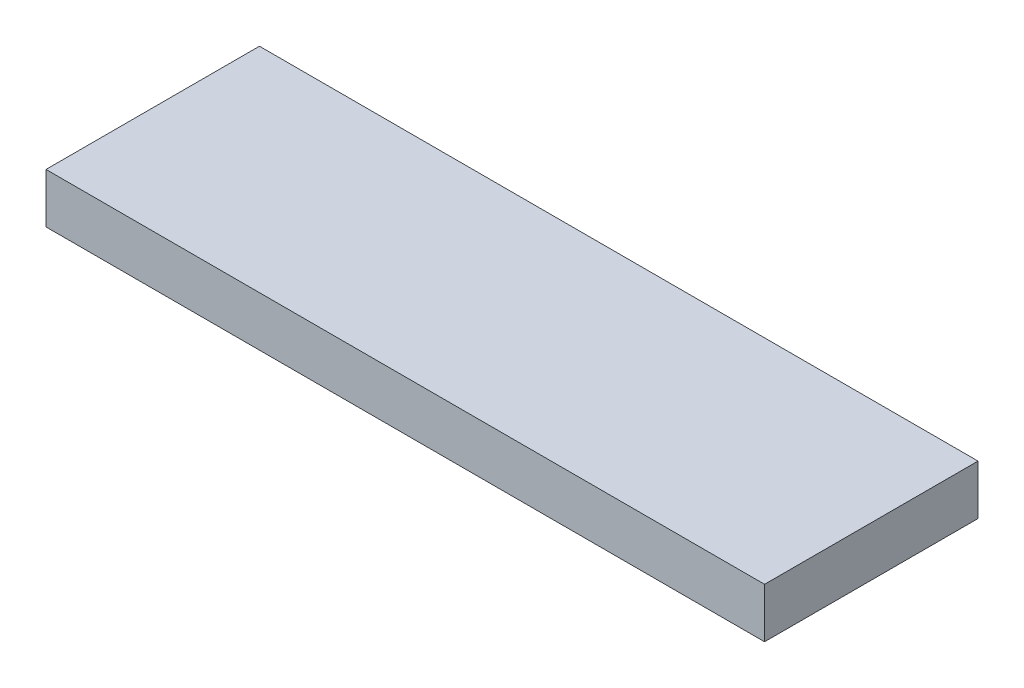
ISO-10303-21;
HEADER;
FILE_DESCRIPTION(('STEP AP214'),'2;1');
FILE_NAME('part.step','',(''),(''),'','','');
FILE_SCHEMA(('AUTOMOTIVE_DESIGN { 1 0 10303 214 1 1 1 1 }'));
ENDSEC;
DATA;
#1=APPLICATION_CONTEXT('core data for automotive mechanical design processes');
#2=APPLICATION_PROTOCOL_DEFINITION('international standard','automotive_design',2000,#1);
#3=PRODUCT_CONTEXT('',#1,'mechanical');
#4=PRODUCT('Part','Part','',(#3));
#5=PRODUCT_RELATED_PRODUCT_CATEGORY('part','',(#4));
#6=PRODUCT_DEFINITION_FORMATION('','',#4);
#7=PRODUCT_DEFINITION_CONTEXT('part definition',#1,'design');
#8=PRODUCT_DEFINITION('design','',#6,#7);
#9=PRODUCT_DEFINITION_SHAPE('','',#8);
#10=(LENGTH_UNIT() NAMED_UNIT(*) SI_UNIT(.MILLI.,.METRE.));
#11=(NAMED_UNIT(*) PLANE_ANGLE_UNIT() SI_UNIT($,.RADIAN.));
#12=(NAMED_UNIT(*) SI_UNIT($,.STERADIAN.) SOLID_ANGLE_UNIT());
#13=UNCERTAINTY_MEASURE_WITH_UNIT(LENGTH_MEASURE(1.E-05),#10,'distance_accuracy_value','');
#14=(GEOMETRIC_REPRESENTATION_CONTEXT(3) GLOBAL_UNCERTAINTY_ASSIGNED_CONTEXT((#13)) GLOBAL_UNIT_ASSIGNED_CONTEXT((#10,
#11,#12)) REPRESENTATION_CONTEXT('',''));
#15=CARTESIAN_POINT('',(0.,0.,0.));
#16=DIRECTION('',(0.,0.,1.));
#17=DIRECTION('',(1.,0.,0.));
#18=AXIS2_PLACEMENT_3D('',#15,#16,#17);
#19=CARTESIAN_POINT('',(-609.,-40.,-410.));
#20=DIRECTION('',(0.,-1.,0.));
#21=DIRECTION('',(0.,0.,-1.));
#22=AXIS2_PLACEMENT_3D('',#19,#20,#21);
#23=CYLINDRICAL_SURFACE('',#22,3.39999999999996);
#24=CARTESIAN_POINT('',(-609.,-40.,-410.));
#25=DIRECTION('',(0.,-1.,0.));
#26=DIRECTION('',(0.,0.,-1.));
#27=AXIS2_PLACEMENT_3D('',#24,#25,#26);
#28=CIRCLE('',#27,3.39999999999996);
#29=CARTESIAN_POINT('',(-609.,-40.,-413.4));
#30=VERTEX_POINT('',#29);
#31=EDGE_CURVE('E104',#30,#30,#28,.F.);
#32=ORIENTED_EDGE('',*,*,#31,.F.);
#33=EDGE_LOOP('',(#32));
#34=FACE_BOUND('',#33,.T.);
#35=CARTESIAN_POINT('',(-609.,-30.,-410.));
#36=DIRECTION('',(0.,-1.,0.));
#37=DIRECTION('',(0.,0.,-1.));
#38=AXIS2_PLACEMENT_3D('',#35,#36,#37);
#39=CIRCLE('',#38,3.39999999999996);
#40=CARTESIAN_POINT('',(-609.,-30.,-413.4));
#41=VERTEX_POINT('',#40);
#42=EDGE_CURVE('E45',#41,#41,#39,.T.);
#43=ORIENTED_EDGE('',*,*,#42,.F.);
#44=EDGE_LOOP('',(#43));
#45=FACE_BOUND('',#44,.T.);
#46=ADVANCED_FACE('F42',(#34,#45),#23,.F.);
#47=CARTESIAN_POINT('',(-469.,-40.,-410.));
#48=DIRECTION('',(0.,-1.,0.));
#49=DIRECTION('',(0.,0.,-1.));
#50=AXIS2_PLACEMENT_3D('',#47,#48,#49);
#51=CYLINDRICAL_SURFACE('',#50,3.40000000000001);
#52=CARTESIAN_POINT('',(-469.,-40.,-410.));
#53=DIRECTION('',(0.,-1.,0.));
#54=DIRECTION('',(0.,0.,-1.));
#55=AXIS2_PLACEMENT_3D('',#52,#53,#54);
#56=CIRCLE('',#55,3.40000000000001);
#57=CARTESIAN_POINT('',(-469.,-40.,-413.4));
#58=VERTEX_POINT('',#57);
#59=EDGE_CURVE('E123',#58,#58,#56,.F.);
#60=ORIENTED_EDGE('',*,*,#59,.F.);
#61=EDGE_LOOP('',(#60));
#62=FACE_BOUND('',#61,.T.);
#63=CARTESIAN_POINT('',(-469.,-30.,-410.));
#64=DIRECTION('',(0.,-1.,0.));
#65=DIRECTION('',(0.,0.,-1.));
#66=AXIS2_PLACEMENT_3D('',#63,#64,#65);
#67=CIRCLE('',#66,3.40000000000001);
#68=CARTESIAN_POINT('',(-469.,-30.,-413.4));
#69=VERTEX_POINT('',#68);
#70=EDGE_CURVE('E128',#69,#69,#67,.T.);
#71=ORIENTED_EDGE('',*,*,#70,.F.);
#72=EDGE_LOOP('',(#71));
#73=FACE_BOUND('',#72,.T.);
#74=ADVANCED_FACE('F141',(#62,#73),#51,.F.);
#75=CARTESIAN_POINT('',(-640.,-40.,-380.));
#76=DIRECTION('',(1.,0.,0.));
#77=DIRECTION('',(0.,0.,-1.));
#78=AXIS2_PLACEMENT_3D('',#75,#76,#77);
#79=PLANE('',#78);
#80=DIRECTION('',(0.,-1.,0.));
#81=VECTOR('',#80,1.);
#82=CARTESIAN_POINT('',(-640.,-40.,-440.));
#83=LINE('',#82,#81);
#84=CARTESIAN_POINT('',(-640.,-26.,-440.));
#85=VERTEX_POINT('',#84);
#86=CARTESIAN_POINT('',(-640.,-40.,-440.));
#87=VERTEX_POINT('',#86);
#88=EDGE_CURVE('E85',#85,#87,#83,.T.);
#89=ORIENTED_EDGE('',*,*,#88,.T.);
#90=DIRECTION('',(0.,0.,-1.));
#91=VECTOR('',#90,1.);
#92=CARTESIAN_POINT('',(-640.,-40.,0.));
#93=LINE('',#92,#91);
#94=CARTESIAN_POINT('',(-640.,-40.,-380.));
#95=VERTEX_POINT('',#94);
#96=EDGE_CURVE('E74',#95,#87,#93,.T.);
#97=ORIENTED_EDGE('',*,*,#96,.F.);
#98=DIRECTION('',(0.,1.,0.));
#99=VECTOR('',#98,1.);
#100=CARTESIAN_POINT('',(-640.,-40.,-380.));
#101=LINE('',#100,#99);
#102=CARTESIAN_POINT('',(-640.,-26.,-380.));
#103=VERTEX_POINT('',#102);
#104=EDGE_CURVE('E98',#95,#103,#101,.T.);
#105=ORIENTED_EDGE('',*,*,#104,.T.);
#106=DIRECTION('',(0.,0.,1.));
#107=VECTOR('',#106,1.);
#108=CARTESIAN_POINT('',(-640.,-26.,-440.));
#109=LINE('',#108,#107);
#110=EDGE_CURVE('E102',#85,#103,#109,.T.);
#111=ORIENTED_EDGE('',*,*,#110,.F.);
#112=EDGE_LOOP('',(#89,#97,#105,#111));
#113=FACE_BOUND('',#112,.T.);
#114=ADVANCED_FACE('F100',(#113),#79,.F.);
#115=CARTESIAN_POINT('',(-640.,-40.,-440.));
#116=DIRECTION('',(0.,0.,1.));
#117=DIRECTION('',(0.,-1.,0.));
#118=AXIS2_PLACEMENT_3D('',#115,#116,#117);
#119=PLANE('',#118);
#120=DIRECTION('',(0.,1.,0.));
#121=VECTOR('',#120,1.);
#122=CARTESIAN_POINT('',(-438.,-40.,-440.));
#123=LINE('',#122,#121);
#124=CARTESIAN_POINT('',(-438.,-26.,-440.));
#125=VERTEX_POINT('',#124);
#126=CARTESIAN_POINT('',(-438.,-40.,-440.));
#127=VERTEX_POINT('',#126);
#128=EDGE_CURVE('E90',#125,#127,#123,.F.);
#129=ORIENTED_EDGE('',*,*,#128,.T.);
#130=DIRECTION('',(1.,0.,0.));
#131=VECTOR('',#130,1.);
#132=CARTESIAN_POINT('',(0.,-40.,-440.));
#133=LINE('',#132,#131);
#134=EDGE_CURVE('E120',#87,#127,#133,.T.);
#135=ORIENTED_EDGE('',*,*,#134,.F.);
#136=ORIENTED_EDGE('',*,*,#88,.F.);
#137=DIRECTION('',(-1.,0.,0.));
#138=VECTOR('',#137,1.);
#139=CARTESIAN_POINT('',(-438.,-26.,-440.));
#140=LINE('',#139,#138);
#141=EDGE_CURVE('E113',#125,#85,#140,.T.);
#142=ORIENTED_EDGE('',*,*,#141,.F.);
#143=EDGE_LOOP('',(#129,#135,#136,#142));
#144=FACE_BOUND('',#143,.T.);
#145=ADVANCED_FACE('F165',(#144),#119,.F.);
#146=CARTESIAN_POINT('',(-438.,-40.,-380.));
#147=DIRECTION('',(-1.,0.,0.));
#148=DIRECTION('',(0.,0.,1.));
#149=AXIS2_PLACEMENT_3D('',#146,#147,#148);
#150=PLANE('',#149);
#151=DIRECTION('',(0.,1.,0.));
#152=VECTOR('',#151,1.);
#153=CARTESIAN_POINT('',(-438.,-40.,-380.));
#154=LINE('',#153,#152);
#155=CARTESIAN_POINT('',(-438.,-26.,-380.));
#156=VERTEX_POINT('',#155);
#157=CARTESIAN_POINT('',(-438.,-40.,-380.));
#158=VERTEX_POINT('',#157);
#159=EDGE_CURVE('E60',#156,#158,#154,.F.);
#160=ORIENTED_EDGE('',*,*,#159,.T.);
#161=DIRECTION('',(0.,0.,-1.));
#162=VECTOR('',#161,1.);
#163=CARTESIAN_POINT('',(-438.,-40.,0.));
#164=LINE('',#163,#162);
#165=EDGE_CURVE('E51',#127,#158,#164,.F.);
#166=ORIENTED_EDGE('',*,*,#165,.F.);
#167=ORIENTED_EDGE('',*,*,#128,.F.);
#168=DIRECTION('',(0.,0.,-1.));
#169=VECTOR('',#168,1.);
#170=CARTESIAN_POINT('',(-438.,-26.,-380.));
#171=LINE('',#170,#169);
#172=EDGE_CURVE('E110',#156,#125,#171,.T.);
#173=ORIENTED_EDGE('',*,*,#172,.F.);
#174=EDGE_LOOP('',(#160,#166,#167,#173));
#175=FACE_BOUND('',#174,.T.);
#176=ADVANCED_FACE('F158',(#175),#150,.F.);
#177=CARTESIAN_POINT('',(-640.,-40.,-380.));
#178=DIRECTION('',(0.,0.,-1.));
#179=DIRECTION('',(0.,1.,0.));
#180=AXIS2_PLACEMENT_3D('',#177,#178,#179);
#181=PLANE('',#180);
#182=ORIENTED_EDGE('',*,*,#104,.F.);
#183=DIRECTION('',(1.,0.,0.));
#184=VECTOR('',#183,1.);
#185=CARTESIAN_POINT('',(0.,-40.,-380.));
#186=LINE('',#185,#184);
#187=EDGE_CURVE('E11',#158,#95,#186,.F.);
#188=ORIENTED_EDGE('',*,*,#187,.F.);
#189=ORIENTED_EDGE('',*,*,#159,.F.);
#190=DIRECTION('',(1.,0.,0.));
#191=VECTOR('',#190,1.);
#192=CARTESIAN_POINT('',(-640.,-26.,-380.));
#193=LINE('',#192,#191);
#194=EDGE_CURVE('E107',#103,#156,#193,.T.);
#195=ORIENTED_EDGE('',*,*,#194,.F.);
#196=EDGE_LOOP('',(#182,#188,#189,#195));
#197=FACE_BOUND('',#196,.T.);
#198=ADVANCED_FACE('F108',(#197),#181,.F.);
#199=CARTESIAN_POINT('',(0.,-40.,0.));
#200=DIRECTION('',(0.,-1.,0.));
#201=DIRECTION('',(0.,0.,-1.));
#202=AXIS2_PLACEMENT_3D('',#199,#200,#201);
#203=PLANE('',#202);
#204=ORIENTED_EDGE('',*,*,#165,.T.);
#205=ORIENTED_EDGE('',*,*,#187,.T.);
#206=ORIENTED_EDGE('',*,*,#96,.T.);
#207=ORIENTED_EDGE('',*,*,#134,.T.);
#208=EDGE_LOOP('',(#204,#205,#206,#207));
#209=FACE_BOUND('',#208,.T.);
#210=ORIENTED_EDGE('',*,*,#59,.T.);
#211=EDGE_LOOP('',(#210));
#212=FACE_BOUND('',#211,.T.);
#213=ORIENTED_EDGE('',*,*,#31,.T.);
#214=EDGE_LOOP('',(#213));
#215=FACE_BOUND('',#214,.T.);
#216=ADVANCED_FACE('F150',(#209,#212,#215),#203,.T.);
#217=CARTESIAN_POINT('',(0.,-30.,0.));
#218=DIRECTION('',(0.,1.,0.));
#219=DIRECTION('',(0.,0.,1.));
#220=AXIS2_PLACEMENT_3D('',#217,#218,#219);
#221=PLANE('',#220);
#222=ORIENTED_EDGE('',*,*,#42,.T.);
#223=EDGE_LOOP('',(#222));
#224=FACE_BOUND('',#223,.T.);
#225=ADVANCED_FACE('F138',(#224),#221,.F.);
#226=ORIENTED_EDGE('',*,*,#70,.T.);
#227=EDGE_LOOP('',(#226));
#228=FACE_BOUND('',#227,.T.);
#229=ADVANCED_FACE('F149',(#228),#221,.F.);
#230=CARTESIAN_POINT('',(0.,-26.,0.));
#231=DIRECTION('',(0.,1.,0.));
#232=DIRECTION('',(0.,0.,1.));
#233=AXIS2_PLACEMENT_3D('',#230,#231,#232);
#234=PLANE('',#233);
#235=ORIENTED_EDGE('',*,*,#110,.T.);
#236=ORIENTED_EDGE('',*,*,#194,.T.);
#237=ORIENTED_EDGE('',*,*,#172,.T.);
#238=ORIENTED_EDGE('',*,*,#141,.T.);
#239=EDGE_LOOP('',(#235,#236,#237,#238));
#240=FACE_BOUND('',#239,.T.);
#241=ADVANCED_FACE('F112',(#240),#234,.T.);
#242=CLOSED_SHELL('',(#46,#74,#114,#145,#176,#198,#216,#225,#229,#241));
#243=MANIFOLD_SOLID_BREP('B2',#242);
#244=ADVANCED_BREP_SHAPE_REPRESENTATION('',(#18,#243),#14);
#245=SHAPE_DEFINITION_REPRESENTATION(#9,#244);
ENDSEC;
END-ISO-10303-21;
